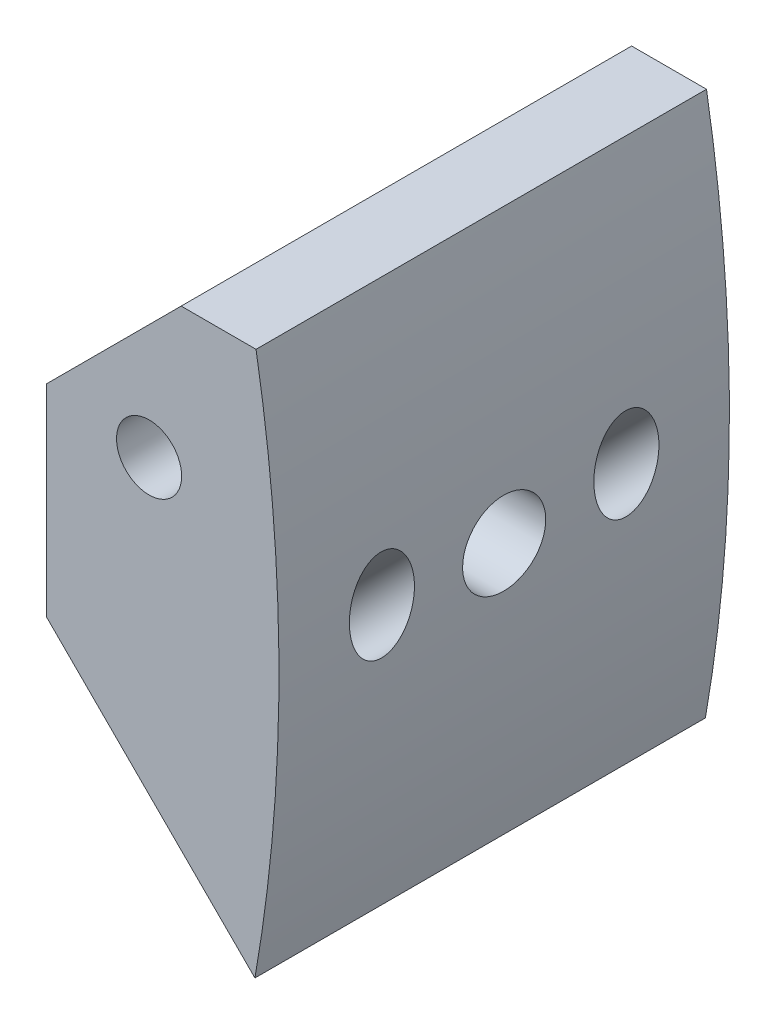
ISO-10303-21;
HEADER;
FILE_DESCRIPTION(('STEP AP214'),'2;1');
FILE_NAME('part.step','',(''),(''),'','','');
FILE_SCHEMA(('AUTOMOTIVE_DESIGN { 1 0 10303 214 1 1 1 1 }'));
ENDSEC;
DATA;
#1=APPLICATION_CONTEXT('core data for automotive mechanical design processes');
#2=APPLICATION_PROTOCOL_DEFINITION('international standard','automotive_design',2000,#1);
#3=PRODUCT_CONTEXT('',#1,'mechanical');
#4=PRODUCT('Part','Part','',(#3));
#5=PRODUCT_RELATED_PRODUCT_CATEGORY('part','',(#4));
#6=PRODUCT_DEFINITION_FORMATION('','',#4);
#7=PRODUCT_DEFINITION_CONTEXT('part definition',#1,'design');
#8=PRODUCT_DEFINITION('design','',#6,#7);
#9=PRODUCT_DEFINITION_SHAPE('','',#8);
#10=(LENGTH_UNIT() NAMED_UNIT(*) SI_UNIT(.MILLI.,.METRE.));
#11=(NAMED_UNIT(*) PLANE_ANGLE_UNIT() SI_UNIT($,.RADIAN.));
#12=(NAMED_UNIT(*) SI_UNIT($,.STERADIAN.) SOLID_ANGLE_UNIT());
#13=UNCERTAINTY_MEASURE_WITH_UNIT(LENGTH_MEASURE(1.E-05),#10,'distance_accuracy_value','');
#14=(GEOMETRIC_REPRESENTATION_CONTEXT(3) GLOBAL_UNCERTAINTY_ASSIGNED_CONTEXT((#13)) GLOBAL_UNIT_ASSIGNED_CONTEXT((#10,
#11,#12)) REPRESENTATION_CONTEXT('',''));
#15=CARTESIAN_POINT('',(0.,0.,0.));
#16=DIRECTION('',(0.,0.,1.));
#17=DIRECTION('',(1.,0.,0.));
#18=AXIS2_PLACEMENT_3D('',#15,#16,#17);
#19=CARTESIAN_POINT('',(-47.244,-6.58729003997056,18.7198));
#20=DIRECTION('',(0.,0.,-1.));
#21=DIRECTION('',(-1.,0.,0.));
#22=AXIS2_PLACEMENT_3D('',#19,#20,#21);
#23=CYLINDRICAL_SURFACE('',#22,66.294);
#24=CARTESIAN_POINT('',(19.05,-6.58729003997057,11.0871));
#25=CARTESIAN_POINT('',(19.0499996965808,-6.49029011763072,11.0870957038607));
#26=CARTESIAN_POINT('',(19.0497848234207,-6.3932202802505,11.0789012698086));
#27=CARTESIAN_POINT('',(19.0489483082885,-6.20175517058592,11.0463264377884));
#28=CARTESIAN_POINT('',(19.0483261795265,-6.10736324023725,11.0219266691839));
#29=CARTESIAN_POINT('',(19.0467456131249,-5.9240554226076,10.9576373316004));
#30=CARTESIAN_POINT('',(19.0457873390727,-5.83513689635548,10.9177552961659));
#31=CARTESIAN_POINT('',(19.0436425963866,-5.66528198959924,10.8236442233512));
#32=CARTESIAN_POINT('',(19.0424561837321,-5.58434365830945,10.7694187042804));
#33=CARTESIAN_POINT('',(19.0399882662549,-5.43269097827881,10.648135365401));
#34=CARTESIAN_POINT('',(19.0387067314511,-5.36197987388215,10.5810734891702));
#35=CARTESIAN_POINT('',(19.0361932730682,-5.2328160281673,10.4360277439134));
#36=CARTESIAN_POINT('',(19.0349613514597,-5.17436377337172,10.3580434416087));
#37=CARTESIAN_POINT('',(19.032685916437,-5.07137329412594,10.193356396944));
#38=CARTESIAN_POINT('',(19.0316424263435,-5.02683679141392,10.1066525775073));
#39=CARTESIAN_POINT('',(19.0298617644816,-4.95295334594229,9.92699542845012));
#40=CARTESIAN_POINT('',(19.0291245916354,-4.92360634973139,9.8340421208227));
#41=CARTESIAN_POINT('',(19.0280398829489,-4.8809413263353,9.64454701808837));
#42=CARTESIAN_POINT('',(19.0276922582412,-4.86761964325202,9.54800604662771));
#43=CARTESIAN_POINT('',(19.0274255738305,-4.85737214696877,9.35405747529695));
#44=CARTESIAN_POINT('',(19.0275065126475,-4.86044627714623,9.25664987842089));
#45=CARTESIAN_POINT('',(19.0280877451644,-4.88290002733904,9.06375790994818));
#46=CARTESIAN_POINT('',(19.0285879370586,-4.9022756889159,8.96827307721711));
#47=CARTESIAN_POINT('',(19.0299511275993,-4.95677637963944,8.78191186219641));
#48=CARTESIAN_POINT('',(19.0308141269425,-4.99190143902833,8.69103548875638));
#49=CARTESIAN_POINT('',(19.0328057619046,-5.07690839178007,8.51645815347474));
#50=CARTESIAN_POINT('',(19.0339344301956,-5.12679210035419,8.43275807590188));
#51=CARTESIAN_POINT('',(19.036330130382,-5.23989896873011,8.27491899974449));
#52=CARTESIAN_POINT('',(19.0375971625022,-5.30312215019547,8.20078001668767));
#53=CARTESIAN_POINT('',(19.0401272077553,-5.44113569133263,8.06414459374687));
#54=CARTESIAN_POINT('',(19.0413902195809,-5.51592948571427,8.00165162313855));
#55=CARTESIAN_POINT('',(19.0437694771187,-5.67494899416805,7.89010889306282));
#56=CARTESIAN_POINT('',(19.0448857228083,-5.75917470968648,7.84105913565682));
#57=CARTESIAN_POINT('',(19.0468456242787,-5.93466908917434,7.75779558672417));
#58=CARTESIAN_POINT('',(19.0476892780887,-6.02593780405674,7.7235819024575));
#59=CARTESIAN_POINT('',(19.0490088586277,-6.21292650873927,7.67096391731566));
#60=CARTESIAN_POINT('',(19.0494847861157,-6.30864648935182,7.65255958381096));
#61=CARTESIAN_POINT('',(19.0500151667441,-6.50179041461503,7.6320869831968));
#62=CARTESIAN_POINT('',(19.050069743725,-6.59921385015981,7.63001391611013));
#63=CARTESIAN_POINT('',(19.0497515988955,-6.79302563666371,7.64225018957412));
#64=CARTESIAN_POINT('',(19.0493788774536,-6.88941398851568,7.65655951599222));
#65=CARTESIAN_POINT('',(19.0482482255402,-7.07840609586226,7.701150411519));
#66=CARTESIAN_POINT('',(19.0474903475853,-7.17101036546318,7.73142980310495));
#67=CARTESIAN_POINT('',(19.0456747947692,-7.34982136180033,7.8070990889758));
#68=CARTESIAN_POINT('',(19.0446171194631,-7.43602807904024,7.85248900568973));
#69=CARTESIAN_POINT('',(19.0423208355982,-7.59961895748349,7.95710324508831));
#70=CARTESIAN_POINT('',(19.0410821847991,-7.67700105145836,8.0163307994683));
#71=CARTESIAN_POINT('',(19.0385636995081,-7.82072532163809,8.14693430724377));
#72=CARTESIAN_POINT('',(19.0372838649327,-7.88706747548156,8.21831028524527));
#73=CARTESIAN_POINT('',(19.0348269424432,-8.00684464408938,8.37120508147937));
#74=CARTESIAN_POINT('',(19.0336498792266,-8.06027656174518,8.45272632642443));
#75=CARTESIAN_POINT('',(19.0315315961777,-8.15269532300266,8.623585127682));
#76=CARTESIAN_POINT('',(19.0305903758834,-8.19168219490804,8.71292266867879));
#77=CARTESIAN_POINT('',(19.0290500742096,-8.25409875185362,8.89686640836887));
#78=CARTESIAN_POINT('',(19.0284509486511,-8.27753044579814,8.99147192500783));
#79=CARTESIAN_POINT('',(19.0276622613252,-8.30817809781455,9.18327581664484));
#80=CARTESIAN_POINT('',(19.0274726994678,-8.31539405945109,9.2804741910729));
#81=CARTESIAN_POINT('',(19.0275245282422,-8.31340516458679,9.47467358644387));
#82=CARTESIAN_POINT('',(19.0277657905008,-8.30420519955953,9.57167465755556));
#83=CARTESIAN_POINT('',(19.0286517995259,-8.26965564739085,9.76275500902498));
#84=CARTESIAN_POINT('',(19.0292965470955,-8.24430602810661,9.85683428356705));
#85=CARTESIAN_POINT('',(19.0309168270153,-8.17817727251902,10.0394027224271));
#86=CARTESIAN_POINT('',(19.0318923651202,-8.13739786778749,10.1278917894623));
#87=CARTESIAN_POINT('',(19.0340642058242,-8.0415692386408,10.2967653761377));
#88=CARTESIAN_POINT('',(19.0352605002712,-7.98652054112911,10.3771501948806));
#89=CARTESIAN_POINT('',(19.0377393259736,-7.86370321135577,10.5275549056016));
#90=CARTESIAN_POINT('',(19.0390218737009,-7.79593214503367,10.5975728095751));
#91=CARTESIAN_POINT('',(19.0415287850443,-7.64957731166828,10.7252560272962));
#92=CARTESIAN_POINT('',(19.0427531341612,-7.57099086895314,10.7829182752599));
#93=CARTESIAN_POINT('',(19.0450059931981,-7.4052095376815,10.8842608260837));
#94=CARTESIAN_POINT('',(19.046034383979,-7.31800946079425,10.9279326339297));
#95=CARTESIAN_POINT('',(19.0477771868896,-7.13757985767573,10.9999656701603));
#96=CARTESIAN_POINT('',(19.0484919737294,-7.04435768066933,11.0283451798781));
#97=CARTESIAN_POINT('',(19.0493357183067,-6.89000278840161,11.0614566402422));
#98=CARTESIAN_POINT('',(19.0495837449924,-6.82987223063493,11.0710608245613));
#99=CARTESIAN_POINT('',(19.0499159809689,-6.70893362867922,11.0838838509421));
#100=CARTESIAN_POINT('',(19.0500001902958,-6.64812558463983,11.0871026944142));
#101=CARTESIAN_POINT('',(19.05,-6.58729003997057,11.0871));
#102=B_SPLINE_CURVE_WITH_KNOTS('',3,(#24,#25,#26,#27,#28,#29,#30,#31,#32,#33,#34,#35,#36,#37,
#38,#39,#40,#41,#42,#43,#44,#45,#46,#47,#48,#49,#50,#51,#52,#53,#54,#55,#56,#57,#58,#59,#60,#61,
#62,#63,#64,#65,#66,#67,#68,#69,#70,#71,#72,#73,#74,#75,#76,#77,#78,#79,#80,#81,#82,#83,#84,#85,
#86,#87,#88,#89,#90,#91,#92,#93,#94,#95,#96,#97,#98,#99,#100,#101),.UNSPECIFIED.,.T.,.F.,(4,2,2,
2,2,2,2,2,2,2,2,2,2,2,2,2,2,2,2,2,2,2,2,2,2,2,2,2,2,2,2,2,2,2,2,2,2,2,4),(0.,0.290777711365592,
0.581903623562939,0.872888053476482,1.16380117397663,1.4548063782738,1.74582312964384,
2.03687587306248,2.3279275922707,2.61891290046217,2.90989720374316,3.20081086880587,
3.49172509248768,3.78267511148184,4.07362560298806,4.36466262879617,4.65569969923233,
4.94673887373656,5.23777744755217,5.52873047805297,5.81968325755811,6.11059637582465,
6.40150992590461,6.69249148509315,6.98347363365747,7.27452551839871,7.56557683284851,
7.85659055158264,8.14760420634426,8.43853116189429,8.72945869648085,9.02039129249465,
9.31131314715163,9.60229071819405,9.89334040552073,10.1845664851068,10.4754436387533,
10.6578110461634,10.84017841329),.UNSPECIFIED.);
#103=CARTESIAN_POINT('',(19.05,-6.58729003997057,11.0871));
#104=VERTEX_POINT('',#103);
#105=EDGE_CURVE('E98',#104,#104,#102,.T.);
#106=ORIENTED_EDGE('',*,*,#105,.T.);
#107=EDGE_LOOP('',(#106));
#108=FACE_BOUND('',#107,.T.);
#109=CARTESIAN_POINT('',(19.03093950099,-8.17689066280571,14.4399));
#110=CARTESIAN_POINT('',(19.0309397504888,-8.17688373606508,14.4994299092389));
#111=CARTESIAN_POINT('',(19.0310783077648,-8.17113538618392,14.5590630278307));
#112=CARTESIAN_POINT('',(19.0316118028481,-8.14864667310725,14.6762839148779));
#113=CARTESIAN_POINT('',(19.0320074198384,-8.13187718939261,14.7338658374767));
#114=CARTESIAN_POINT('',(19.0329949072261,-8.08890022916926,14.8448157281223));
#115=CARTESIAN_POINT('',(19.0335852014114,-8.06276841304478,14.8982134109924));
#116=CARTESIAN_POINT('',(19.0348944566818,-8.0027362014352,15.0003633799949));
#117=CARTESIAN_POINT('',(19.0356134275248,-7.96883521673711,15.0491153133967));
#118=CARTESIAN_POINT('',(19.0374439992075,-7.87857983434721,15.1619693773191));
#119=CARTESIAN_POINT('',(19.0385893749711,-7.8189027046317,15.2234114026122));
#120=CARTESIAN_POINT('',(19.0408509914559,-7.69052187414516,15.3360267127651));
#121=CARTESIAN_POINT('',(19.041967154257,-7.62179650096414,15.387174572624));
#122=CARTESIAN_POINT('',(19.0444749663972,-7.44905546769553,15.4983692864074));
#123=CARTESIAN_POINT('',(19.0457959560247,-7.34199252826299,15.5536745420608));
#124=CARTESIAN_POINT('',(19.0479480347883,-7.12057220248545,15.646582539313));
#125=CARTESIAN_POINT('',(19.0487787239021,-7.00620894407258,15.6841708211072));
#126=CARTESIAN_POINT('',(19.0498564383536,-6.76997817793614,15.7436243327146));
#127=CARTESIAN_POINT('',(19.0500858867901,-6.64798929327223,15.7650033410691));
#128=CARTESIAN_POINT('',(19.0498557455246,-6.40218118767083,15.7907531443561));
#129=CARTESIAN_POINT('',(19.049395635741,-6.27836065501827,15.7951110926511));
#130=CARTESIAN_POINT('',(19.047618940738,-6.00612452257654,15.7858256043066));
#131=CARTESIAN_POINT('',(19.0461473478288,-5.85782262926841,15.7683452337203));
#132=CARTESIAN_POINT('',(19.0423022857426,-5.56668691032533,15.7071205546782));
#133=CARTESIAN_POINT('',(19.0399301478624,-5.42384535400005,15.6634149604779));
#134=CARTESIAN_POINT('',(19.0355406405651,-5.19998639905921,15.5683606782304));
#135=CARTESIAN_POINT('',(19.0337064139218,-5.11532901326914,15.5255267391557));
#136=CARTESIAN_POINT('',(19.0299155060611,-4.95356747771057,15.4273827974884));
#137=CARTESIAN_POINT('',(19.027959034268,-4.87645096090689,15.3720937306922));
#138=CARTESIAN_POINT('',(19.024542635703,-4.74941051854124,15.2623773367114));
#139=CARTESIAN_POINT('',(19.0230696560592,-4.69726495319207,15.2105314965473));
#140=CARTESIAN_POINT('',(19.0202826253287,-4.60195624247808,15.0991094905497));
#141=CARTESIAN_POINT('',(19.0189683855247,-4.55878238621959,15.039542682043));
#142=CARTESIAN_POINT('',(19.0168442878389,-4.49064821714003,14.9246017053715));
#143=CARTESIAN_POINT('',(19.0159863530743,-4.46381854329087,14.8703411050301));
#144=CARTESIAN_POINT('',(19.0145527172215,-4.41954414804442,14.758094370884));
#145=CARTESIAN_POINT('',(19.013976842422,-4.40209364968191,14.7001105550368));
#146=CARTESIAN_POINT('',(19.0131684031765,-4.37771401365817,14.5816521154748));
#147=CARTESIAN_POINT('',(19.0129374776605,-4.37083509949825,14.5211669953215));
#148=CARTESIAN_POINT('',(19.0128527528125,-4.36830329984476,14.3999620861377));
#149=CARTESIAN_POINT('',(19.0129988993884,-4.37264880418048,14.3392423320138));
#150=CARTESIAN_POINT('',(19.0136241974261,-4.39144250263048,14.2242810975946));
#151=CARTESIAN_POINT('',(19.014076552431,-4.40507828136987,14.1699031685768));
#152=CARTESIAN_POINT('',(19.015241347591,-4.44073747283191,14.0639978827775));
#153=CARTESIAN_POINT('',(19.0159538266458,-4.46276214007438,14.0124709536704));
#154=CARTESIAN_POINT('',(19.0176312994868,-4.51572192999796,13.9099739407884));
#155=CARTESIAN_POINT('',(19.0186096764612,-4.54714242000995,13.8592568449645));
#156=CARTESIAN_POINT('',(19.0207157564483,-4.61673228492073,13.7627203721038));
#157=CARTESIAN_POINT('',(19.0218435475059,-4.65490564355157,13.7169039118506));
#158=CARTESIAN_POINT('',(19.0247893239268,-4.75812271316617,13.6077150544386));
#159=CARTESIAN_POINT('',(19.0266591863696,-4.82676178455779,13.5477309020521));
#160=CARTESIAN_POINT('',(19.0303784714529,-4.97280178226283,13.4395477614496));
#161=CARTESIAN_POINT('',(19.0322278326506,-5.05022380333932,13.3913780646114));
#162=CARTESIAN_POINT('',(19.0363846714238,-5.23939545277268,13.2912285417164));
#163=CARTESIAN_POINT('',(19.0386232667553,-5.35361163971813,13.2439114715794));
#164=CARTESIAN_POINT('',(19.0425725957761,-5.58802140924562,13.1682090928461));
#165=CARTESIAN_POINT('',(19.0442830280784,-5.70821835939102,13.1398345827938));
#166=CARTESIAN_POINT('',(19.0470935469368,-5.95419167506841,13.1002904478532));
#167=CARTESIAN_POINT('',(19.0481788191046,-6.08003276940403,13.089528095931));
#168=CARTESIAN_POINT('',(19.04962884144,-6.33208350038816,13.0857656228831));
#169=CARTESIAN_POINT('',(19.0499928008706,-6.45829338976348,13.0927849757213));
#170=CARTESIAN_POINT('',(19.0500082655554,-6.73136712643059,13.1274798056241));
#171=CARTESIAN_POINT('',(19.0495176363884,-6.87779706126136,13.1586910103579));
#172=CARTESIAN_POINT('',(19.0476554871312,-7.16258461609256,13.2472024912822));
#173=CARTESIAN_POINT('',(19.0462858506555,-7.30095880872602,13.3044469049614));
#174=CARTESIAN_POINT('',(19.0436559695904,-7.50760963247391,13.4177007951448));
#175=CARTESIAN_POINT('',(19.0425877251546,-7.58107921862573,13.4642957488383));
#176=CARTESIAN_POINT('',(19.0403536495612,-7.72029355684978,13.5678924769256));
#177=CARTESIAN_POINT('',(19.0391879872331,-7.78605121734095,13.6248764412789));
#178=CARTESIAN_POINT('',(19.0371545918018,-7.89312224415153,13.7357716497249));
#179=CARTESIAN_POINT('',(19.0362781184018,-7.93662249090891,13.7875615527944));
#180=CARTESIAN_POINT('',(19.0346408386178,-8.01478112524079,13.8975035982089));
#181=CARTESIAN_POINT('',(19.0338799314092,-8.04944723818555,13.9556501177115));
#182=CARTESIAN_POINT('',(19.0326901777474,-8.10233142246484,14.0665400018734));
#183=CARTESIAN_POINT('',(19.0322263601696,-8.1223770676385,14.1184095431279));
#184=CARTESIAN_POINT('',(19.031497923776,-8.15351458340183,14.2247124202177));
#185=CARTESIAN_POINT('',(19.0312327782093,-8.16463013657257,14.2791385669838));
#186=CARTESIAN_POINT('',(19.0310355972113,-8.17287968059016,14.3516161549604));
#187=CARTESIAN_POINT('',(19.0309996503764,-8.17438129465964,14.3692355013328));
#188=CARTESIAN_POINT('',(19.0309515629479,-8.17638790908686,14.4045335208673));
#189=CARTESIAN_POINT('',(19.0309394268578,-8.17689272091015,14.4222122046192));
#190=CARTESIAN_POINT('',(19.03093950099,-8.17689066280571,14.4399));
#191=B_SPLINE_CURVE_WITH_KNOTS('',3,(#109,#110,#111,#112,#113,#114,#115,#116,#117,#118,#119,
#120,#121,#122,#123,#124,#125,#126,#127,#128,#129,#130,#131,#132,#133,#134,#135,#136,#137,#138,
#139,#140,#141,#142,#143,#144,#145,#146,#147,#148,#149,#150,#151,#152,#153,#154,#155,#156,#157,
#158,#159,#160,#161,#162,#163,#164,#165,#166,#167,#168,#169,#170,#171,#172,#173,#174,#175,#176,
#177,#178,#179,#180,#181,#182,#183,#184,#185,#186,#187,#188,#189,#190),.UNSPECIFIED.,.T.,.F.,(4,
2,2,2,2,2,2,2,2,2,2,2,2,2,2,2,2,2,2,2,2,2,2,2,2,2,2,2,2,2,2,2,2,2,2,2,2,2,2,2,4),(0.,
0.178506171985479,0.357485907280734,0.535050712911975,0.712628989500063,0.968185601983157,
1.22436585657518,1.58395316400954,1.94383344457157,2.31412293514639,2.68469184760296,
3.13054371649606,3.5757390226817,3.85954039913289,4.14286824760459,4.36272671799192,
4.58232118248879,4.7631842541117,4.94393579775003,5.12554343021684,5.30712501206479,
5.47457746690626,5.64205497333309,5.82039753309282,5.99884565580937,6.27084425573026,
6.54351055082744,6.91247637575028,7.28165235701928,7.65925056727915,8.03726248996457,
8.48425685284617,8.93029654053938,9.19057455638824,9.45041049905095,9.65262032290747,
9.8546527045458,10.020812348109,10.1865298684965,10.2395583993646,10.2925969590509),.UNSPECIFIED.);
#192=CARTESIAN_POINT('',(19.03093950099,-8.17689066280571,14.4399));
#193=VERTEX_POINT('',#192);
#194=EDGE_CURVE('E148',#193,#193,#191,.T.);
#195=ORIENTED_EDGE('',*,*,#194,.T.);
#196=EDGE_LOOP('',(#195));
#197=FACE_BOUND('',#196,.T.);
#198=CARTESIAN_POINT('',(19.03093950099,-8.17689066280571,4.2799));
#199=CARTESIAN_POINT('',(19.0309397504888,-8.17688373606507,4.33942990923894));
#200=CARTESIAN_POINT('',(19.0310783077648,-8.17113538618392,4.39906302783068));
#201=CARTESIAN_POINT('',(19.0316118028481,-8.14864667310726,4.5162839148779));
#202=CARTESIAN_POINT('',(19.0320074198384,-8.13187718939262,4.57386583747667));
#203=CARTESIAN_POINT('',(19.0329949072261,-8.08890022916927,4.68481572812225));
#204=CARTESIAN_POINT('',(19.0335852014114,-8.06276841304478,4.73821341099243));
#205=CARTESIAN_POINT('',(19.0348944566818,-8.00273620143521,4.84036337999486));
#206=CARTESIAN_POINT('',(19.0356134275248,-7.96883521673713,4.88911531339669));
#207=CARTESIAN_POINT('',(19.0374439992075,-7.87857983434722,5.00196937731906));
#208=CARTESIAN_POINT('',(19.0385893749711,-7.8189027046317,5.06341140261225));
#209=CARTESIAN_POINT('',(19.0408509914559,-7.69052187414516,5.17602671276506));
#210=CARTESIAN_POINT('',(19.0419671542571,-7.62179650096414,5.227174572624));
#211=CARTESIAN_POINT('',(19.0444749663972,-7.44905546769553,5.3383692864074));
#212=CARTESIAN_POINT('',(19.0457959560247,-7.34199252826299,5.39367454206078));
#213=CARTESIAN_POINT('',(19.0479480347883,-7.12057220248546,5.48658253931305));
#214=CARTESIAN_POINT('',(19.0487787239021,-7.00620894407259,5.52417082110724));
#215=CARTESIAN_POINT('',(19.0498564383536,-6.76997817793616,5.58362433271456));
#216=CARTESIAN_POINT('',(19.0500858867901,-6.64798929327225,5.60500334106913));
#217=CARTESIAN_POINT('',(19.0498557455246,-6.40218118767085,5.63075314435609));
#218=CARTESIAN_POINT('',(19.049395635741,-6.27836065501829,5.63511109265105));
#219=CARTESIAN_POINT('',(19.047618940738,-6.00612452257656,5.62582560430656));
#220=CARTESIAN_POINT('',(19.0461473478288,-5.85782262926843,5.60834523372034));
#221=CARTESIAN_POINT('',(19.0423022857426,-5.56668691032535,5.54712055467825));
#222=CARTESIAN_POINT('',(19.0399301478624,-5.42384535400007,5.50341496047786));
#223=CARTESIAN_POINT('',(19.0355406405651,-5.19998639905923,5.4083606782304));
#224=CARTESIAN_POINT('',(19.0337064139218,-5.11532901326916,5.36552673915569));
#225=CARTESIAN_POINT('',(19.0299155060611,-4.95356747771059,5.26738279748837));
#226=CARTESIAN_POINT('',(19.027959034268,-4.87645096090691,5.21209373069217));
#227=CARTESIAN_POINT('',(19.024542635703,-4.74941051854125,5.10237733671143));
#228=CARTESIAN_POINT('',(19.0230696560592,-4.69726495319208,5.05053149654736));
#229=CARTESIAN_POINT('',(19.0202826253288,-4.60195624247809,4.93910949054972));
#230=CARTESIAN_POINT('',(19.0189683855247,-4.55878238621961,4.87954268204305));
#231=CARTESIAN_POINT('',(19.0168442878389,-4.49064821714005,4.76460170537153));
#232=CARTESIAN_POINT('',(19.0159863530743,-4.46381854329089,4.71034110503015));
#233=CARTESIAN_POINT('',(19.0145527172215,-4.41954414804444,4.59809437088406));
#234=CARTESIAN_POINT('',(19.013976842422,-4.40209364968192,4.54011055503678));
#235=CARTESIAN_POINT('',(19.0131684031765,-4.37771401365816,4.42165211547479));
#236=CARTESIAN_POINT('',(19.0129374776606,-4.37083509949824,4.3611669953215));
#237=CARTESIAN_POINT('',(19.0128527528125,-4.36830329984476,4.23996208613773));
#238=CARTESIAN_POINT('',(19.0129988993884,-4.37264880418049,4.1792423320138));
#239=CARTESIAN_POINT('',(19.0136241974261,-4.3914425026305,4.06428109759459));
#240=CARTESIAN_POINT('',(19.014076552431,-4.40507828136988,4.00990316857684));
#241=CARTESIAN_POINT('',(19.015241347591,-4.44073747283192,3.90399788277749));
#242=CARTESIAN_POINT('',(19.0159538266458,-4.46276214007439,3.85247095367045));
#243=CARTESIAN_POINT('',(19.0176312994868,-4.51572192999796,3.74997394078838));
#244=CARTESIAN_POINT('',(19.0186096764612,-4.54714242000995,3.69925684496453));
#245=CARTESIAN_POINT('',(19.0207157564483,-4.61673228492073,3.60272037210379));
#246=CARTESIAN_POINT('',(19.0218435475059,-4.65490564355157,3.55690391185064));
#247=CARTESIAN_POINT('',(19.0247893239268,-4.75812271316617,3.44771505443858));
#248=CARTESIAN_POINT('',(19.0266591863696,-4.82676178455779,3.38773090205209));
#249=CARTESIAN_POINT('',(19.0303784714529,-4.97280178226283,3.2795477614496));
#250=CARTESIAN_POINT('',(19.0322278326506,-5.05022380333931,3.23137806461139));
#251=CARTESIAN_POINT('',(19.0363846714238,-5.23939545277267,3.13122854171637));
#252=CARTESIAN_POINT('',(19.0386232667553,-5.35361163971813,3.08391147157942));
#253=CARTESIAN_POINT('',(19.0425725957761,-5.58802140924561,3.00820909284607));
#254=CARTESIAN_POINT('',(19.0442830280784,-5.70821835939102,2.97983458279381));
#255=CARTESIAN_POINT('',(19.0470935469368,-5.9541916750684,2.94029044785316));
#256=CARTESIAN_POINT('',(19.0481788191046,-6.08003276940402,2.92952809593101));
#257=CARTESIAN_POINT('',(19.04962884144,-6.33208350038815,2.92576562288308));
#258=CARTESIAN_POINT('',(19.0499928008706,-6.45829338976347,2.9327849757213));
#259=CARTESIAN_POINT('',(19.0500082655554,-6.73136712643058,2.96747980562409));
#260=CARTESIAN_POINT('',(19.0495176363884,-6.87779706126134,2.9986910103579));
#261=CARTESIAN_POINT('',(19.0476554871312,-7.16258461609254,3.08720249128223));
#262=CARTESIAN_POINT('',(19.0462858506555,-7.30095880872601,3.14444690496137));
#263=CARTESIAN_POINT('',(19.0436559695904,-7.5076096324739,3.25770079514476));
#264=CARTESIAN_POINT('',(19.0425877251546,-7.58107921862571,3.3042957488383));
#265=CARTESIAN_POINT('',(19.0403536495612,-7.72029355684977,3.40789247692561));
#266=CARTESIAN_POINT('',(19.0391879872331,-7.78605121734095,3.46487644127884));
#267=CARTESIAN_POINT('',(19.0371545918018,-7.89312224415153,3.57577164972491));
#268=CARTESIAN_POINT('',(19.0362781184018,-7.93662249090891,3.62756155279442));
#269=CARTESIAN_POINT('',(19.0346408386178,-8.01478112524079,3.73750359820891));
#270=CARTESIAN_POINT('',(19.0338799314092,-8.04944723818555,3.79565011771152));
#271=CARTESIAN_POINT('',(19.0326901777474,-8.10233142246485,3.9065400018734));
#272=CARTESIAN_POINT('',(19.0322263601695,-8.12237706763851,3.95840954312786));
#273=CARTESIAN_POINT('',(19.031497923776,-8.15351458340183,4.06471242021765));
#274=CARTESIAN_POINT('',(19.0312327782093,-8.16463013657258,4.11913856698381));
#275=CARTESIAN_POINT('',(19.0310355972113,-8.17287968059017,4.19161615496044));
#276=CARTESIAN_POINT('',(19.0309996503764,-8.17438129465965,4.20923550133281));
#277=CARTESIAN_POINT('',(19.0309515629479,-8.17638790908687,4.24453352086731));
#278=CARTESIAN_POINT('',(19.0309394268578,-8.17689272091015,4.26221220461919));
#279=CARTESIAN_POINT('',(19.03093950099,-8.17689066280571,4.2799));
#280=B_SPLINE_CURVE_WITH_KNOTS('',3,(#198,#199,#200,#201,#202,#203,#204,#205,#206,#207,#208,
#209,#210,#211,#212,#213,#214,#215,#216,#217,#218,#219,#220,#221,#222,#223,#224,#225,#226,#227,
#228,#229,#230,#231,#232,#233,#234,#235,#236,#237,#238,#239,#240,#241,#242,#243,#244,#245,#246,
#247,#248,#249,#250,#251,#252,#253,#254,#255,#256,#257,#258,#259,#260,#261,#262,#263,#264,#265,
#266,#267,#268,#269,#270,#271,#272,#273,#274,#275,#276,#277,#278,#279),.UNSPECIFIED.,.T.,.F.,(4,
2,2,2,2,2,2,2,2,2,2,2,2,2,2,2,2,2,2,2,2,2,2,2,2,2,2,2,2,2,2,2,2,2,2,2,2,2,2,2,4),(0.,
0.17850617198548,0.357485907280734,0.535050712911973,0.712628989500063,0.968185601983158,
1.22436585657519,1.58395316400954,1.94383344457157,2.31412293514638,2.68469184760295,
3.13054371649605,3.57573902268169,3.85954039913288,4.14286824760457,4.3627267179919,
4.58232118248878,4.76318425411169,4.94393579775002,5.12554343021683,5.3071250120648,
5.47457746690627,5.64205497333309,5.82039753309282,5.99884565580938,6.27084425573026,
6.54351055082744,6.91247637575027,7.28165235701927,7.65925056727914,8.03726248996456,
8.48425685284616,8.93029654053936,9.19057455638822,9.45041049905094,9.65262032290746,
9.8546527045458,10.020812348109,10.1865298684965,10.2395583993646,10.2925969590509),.UNSPECIFIED.);
#281=CARTESIAN_POINT('',(19.03093950099,-8.17689066280571,4.2799));
#282=VERTEX_POINT('',#281);
#283=EDGE_CURVE('E110',#282,#282,#280,.T.);
#284=ORIENTED_EDGE('',*,*,#283,.T.);
#285=EDGE_LOOP('',(#284));
#286=FACE_BOUND('',#285,.T.);
#287=CARTESIAN_POINT('',(-47.244,-6.58729003997056,18.7198));
#288=DIRECTION('',(0.,0.,1.));
#289=DIRECTION('',(-1.,0.,0.));
#290=AXIS2_PLACEMENT_3D('',#287,#288,#289);
#291=CIRCLE('',#290,66.294);
#292=CARTESIAN_POINT('',(18.0525250935151,-18.0440891877234,18.7198));
#293=VERTEX_POINT('',#292);
#294=CARTESIAN_POINT('',(18.0983115580606,4.60541992005886,18.7198));
#295=VERTEX_POINT('',#294);
#296=EDGE_CURVE('E136',#293,#295,#291,.T.);
#297=ORIENTED_EDGE('',*,*,#296,.F.);
#298=DIRECTION('',(0.,0.,-1.));
#299=VECTOR('',#298,1.);
#300=CARTESIAN_POINT('',(18.0525250935151,-18.0440891877234,18.7198));
#301=LINE('',#300,#299);
#302=CARTESIAN_POINT('',(18.0525250935151,-18.0440891877234,0.));
#303=VERTEX_POINT('',#302);
#304=EDGE_CURVE('E109',#293,#303,#301,.T.);
#305=ORIENTED_EDGE('',*,*,#304,.T.);
#306=CARTESIAN_POINT('',(-47.244,-6.58729003997056,0.));
#307=DIRECTION('',(0.,0.,1.));
#308=DIRECTION('',(-1.,0.,0.));
#309=AXIS2_PLACEMENT_3D('',#306,#307,#308);
#310=CIRCLE('',#309,66.294);
#311=CARTESIAN_POINT('',(18.0983115580606,4.60541992005886,0.));
#312=VERTEX_POINT('',#311);
#313=EDGE_CURVE('E135',#303,#312,#310,.T.);
#314=ORIENTED_EDGE('',*,*,#313,.T.);
#315=DIRECTION('',(0.,0.,-1.));
#316=VECTOR('',#315,1.);
#317=CARTESIAN_POINT('',(18.0983115580606,4.60541992005886,18.7198));
#318=LINE('',#317,#316);
#319=EDGE_CURVE('E131',#312,#295,#318,.F.);
#320=ORIENTED_EDGE('',*,*,#319,.T.);
#321=EDGE_LOOP('',(#297,#305,#314,#320));
#322=FACE_BOUND('',#321,.T.);
#323=ADVANCED_FACE('F42',(#108,#197,#286,#322),#23,.T.);
#324=CARTESIAN_POINT('',(-47.244,-6.58729003997056,18.7198));
#325=DIRECTION('',(0.,0.,-1.));
#326=DIRECTION('',(-1.,0.,0.));
#327=AXIS2_PLACEMENT_3D('',#324,#325,#326);
#328=PLANE('',#327);
#329=CARTESIAN_POINT('',(13.6525,-1.50729003997055,18.7198));
#330=DIRECTION('',(0.,0.,1.));
#331=DIRECTION('',(1.,0.,0.));
#332=AXIS2_PLACEMENT_3D('',#329,#330,#331);
#333=CIRCLE('',#332,1.35254999999999);
#334=CARTESIAN_POINT('',(15.00505,-1.50729003997055,18.7198));
#335=VERTEX_POINT('',#334);
#336=EDGE_CURVE('E113',#335,#335,#333,.T.);
#337=ORIENTED_EDGE('',*,*,#336,.F.);
#338=EDGE_LOOP('',(#337));
#339=FACE_BOUND('',#338,.T.);
#340=DIRECTION('',(1.,0.,0.));
#341=VECTOR('',#340,1.);
#342=CARTESIAN_POINT('',(0.,4.60541992005886,18.7198));
#343=LINE('',#342,#341);
#344=CARTESIAN_POINT('',(14.986,4.60541992005886,18.7198));
#345=VERTEX_POINT('',#344);
#346=EDGE_CURVE('E128',#345,#295,#343,.T.);
#347=ORIENTED_EDGE('',*,*,#346,.F.);
#348=DIRECTION('',(0.707106781186546,0.707106781186549,0.));
#349=VECTOR('',#348,1.);
#350=CARTESIAN_POINT('',(14.986,4.60541992005886,18.7198));
#351=LINE('',#350,#349);
#352=CARTESIAN_POINT('',(9.398,-0.982580079941157,18.7198));
#353=VERTEX_POINT('',#352);
#354=EDGE_CURVE('E67',#345,#353,#351,.F.);
#355=ORIENTED_EDGE('',*,*,#354,.T.);
#356=DIRECTION('',(0.,1.,0.));
#357=VECTOR('',#356,1.);
#358=CARTESIAN_POINT('',(9.398,4.60541992005886,18.7198));
#359=LINE('',#358,#357);
#360=CARTESIAN_POINT('',(9.398,-9.38956409420834,18.7198));
#361=VERTEX_POINT('',#360);
#362=EDGE_CURVE('E92',#361,#353,#359,.T.);
#363=ORIENTED_EDGE('',*,*,#362,.F.);
#364=DIRECTION('',(-0.707106781186548,0.707106781186547,0.));
#365=VECTOR('',#364,1.);
#366=CARTESIAN_POINT('',(7.27621774823213,-7.26778184244048,18.7198));
#367=LINE('',#366,#365);
#368=EDGE_CURVE('E104',#293,#361,#367,.T.);
#369=ORIENTED_EDGE('',*,*,#368,.F.);
#370=ORIENTED_EDGE('',*,*,#296,.T.);
#371=EDGE_LOOP('',(#347,#355,#363,#369,#370));
#372=FACE_BOUND('',#371,.T.);
#373=ADVANCED_FACE('F102',(#339,#372),#328,.F.);
#374=CARTESIAN_POINT('',(-47.244,-6.58729003997056,0.));
#375=DIRECTION('',(0.,0.,-1.));
#376=DIRECTION('',(-1.,0.,0.));
#377=AXIS2_PLACEMENT_3D('',#374,#375,#376);
#378=PLANE('',#377);
#379=DIRECTION('',(0.,1.,0.));
#380=VECTOR('',#379,1.);
#381=CARTESIAN_POINT('',(9.398,4.60541992005886,0.));
#382=LINE('',#381,#380);
#383=CARTESIAN_POINT('',(9.39800000000001,-9.38956409420835,0.));
#384=VERTEX_POINT('',#383);
#385=CARTESIAN_POINT('',(9.398,-0.982580079941164,0.));
#386=VERTEX_POINT('',#385);
#387=EDGE_CURVE('E93',#384,#386,#382,.T.);
#388=ORIENTED_EDGE('',*,*,#387,.T.);
#389=DIRECTION('',(-0.707106781186546,-0.707106781186549,0.));
#390=VECTOR('',#389,1.);
#391=CARTESIAN_POINT('',(-21.7253549800146,-32.1059350599559,0.));
#392=LINE('',#391,#390);
#393=CARTESIAN_POINT('',(14.986,4.60541992005887,0.));
#394=VERTEX_POINT('',#393);
#395=EDGE_CURVE('E11',#386,#394,#392,.F.);
#396=ORIENTED_EDGE('',*,*,#395,.T.);
#397=DIRECTION('',(1.,0.,0.));
#398=VECTOR('',#397,1.);
#399=CARTESIAN_POINT('',(0.,4.60541992005886,0.));
#400=LINE('',#399,#398);
#401=EDGE_CURVE('E129',#394,#312,#400,.T.);
#402=ORIENTED_EDGE('',*,*,#401,.T.);
#403=ORIENTED_EDGE('',*,*,#313,.F.);
#404=DIRECTION('',(0.707106781186548,-0.707106781186547,0.));
#405=VECTOR('',#404,1.);
#406=CARTESIAN_POINT('',(-20.3241370271189,20.3325729329105,0.));
#407=LINE('',#406,#405);
#408=EDGE_CURVE('E138',#384,#303,#407,.T.);
#409=ORIENTED_EDGE('',*,*,#408,.F.);
#410=EDGE_LOOP('',(#388,#396,#402,#403,#409));
#411=FACE_BOUND('',#410,.T.);
#412=CARTESIAN_POINT('',(13.6525,-1.50729003997055,0.));
#413=DIRECTION('',(0.,0.,1.));
#414=DIRECTION('',(1.,0.,0.));
#415=AXIS2_PLACEMENT_3D('',#412,#413,#414);
#416=CIRCLE('',#415,1.35255);
#417=CARTESIAN_POINT('',(15.00505,-1.50729003997055,0.));
#418=VERTEX_POINT('',#417);
#419=EDGE_CURVE('E124',#418,#418,#416,.T.);
#420=ORIENTED_EDGE('',*,*,#419,.T.);
#421=EDGE_LOOP('',(#420));
#422=FACE_BOUND('',#421,.T.);
#423=ADVANCED_FACE('F173',(#411,#422),#378,.T.);
#424=CARTESIAN_POINT('',(0.,4.60541992005886,0.));
#425=DIRECTION('',(0.,-1.,0.));
#426=DIRECTION('',(0.,0.,-1.));
#427=AXIS2_PLACEMENT_3D('',#424,#425,#426);
#428=PLANE('',#427);
#429=ORIENTED_EDGE('',*,*,#401,.F.);
#430=DIRECTION('',(0.,0.,1.));
#431=VECTOR('',#430,1.);
#432=CARTESIAN_POINT('',(14.986,4.60541992005886,0.));
#433=LINE('',#432,#431);
#434=EDGE_CURVE('E143',#394,#345,#433,.T.);
#435=ORIENTED_EDGE('',*,*,#434,.T.);
#436=ORIENTED_EDGE('',*,*,#346,.T.);
#437=ORIENTED_EDGE('',*,*,#319,.F.);
#438=EDGE_LOOP('',(#429,#435,#436,#437));
#439=FACE_BOUND('',#438,.T.);
#440=ADVANCED_FACE('F169',(#439),#428,.F.);
#441=CARTESIAN_POINT('',(13.6525,-1.50729003997055,18.7198));
#442=DIRECTION('',(0.,0.,1.));
#443=DIRECTION('',(1.,0.,0.));
#444=AXIS2_PLACEMENT_3D('',#441,#442,#443);
#445=CYLINDRICAL_SURFACE('',#444,1.35254999999999);
#446=ORIENTED_EDGE('',*,*,#419,.F.);
#447=EDGE_LOOP('',(#446));
#448=FACE_BOUND('',#447,.T.);
#449=ORIENTED_EDGE('',*,*,#336,.T.);
#450=EDGE_LOOP('',(#449));
#451=FACE_BOUND('',#450,.T.);
#452=ADVANCED_FACE('F165',(#448,#451),#445,.F.);
#453=CARTESIAN_POINT('',(7.27621774823213,-7.26778184244048,0.));
#454=DIRECTION('',(0.707106781186547,0.707106781186548,0.));
#455=DIRECTION('',(-0.707106781186548,0.707106781186547,0.));
#456=AXIS2_PLACEMENT_3D('',#453,#454,#455);
#457=PLANE('',#456);
#458=CARTESIAN_POINT('',(12.6517357578998,-12.6432998521082,14.4399));
#459=DIRECTION('',(-0.707106781186547,-0.707106781186548,0.));
#460=DIRECTION('',(0.707106781186548,-0.707106781186547,0.));
#461=AXIS2_PLACEMENT_3D('',#458,#459,#460);
#462=CIRCLE('',#461,1.35254999999999);
#463=CARTESIAN_POINT('',(13.6081330347937,-13.599697129002,14.4399));
#464=VERTEX_POINT('',#463);
#465=EDGE_CURVE('E211',#464,#464,#462,.T.);
#466=ORIENTED_EDGE('',*,*,#465,.F.);
#467=EDGE_LOOP('',(#466));
#468=FACE_BOUND('',#467,.T.);
#469=CARTESIAN_POINT('',(12.6517357578998,-12.6432998521082,4.2799));
#470=DIRECTION('',(-0.707106781186547,-0.707106781186548,0.));
#471=DIRECTION('',(0.707106781186548,-0.707106781186547,0.));
#472=AXIS2_PLACEMENT_3D('',#469,#470,#471);
#473=CIRCLE('',#472,1.35254999999999);
#474=CARTESIAN_POINT('',(13.6081330347937,-13.599697129002,4.2799));
#475=VERTEX_POINT('',#474);
#476=EDGE_CURVE('E117',#475,#475,#473,.T.);
#477=ORIENTED_EDGE('',*,*,#476,.F.);
#478=EDGE_LOOP('',(#477));
#479=FACE_BOUND('',#478,.T.);
#480=ORIENTED_EDGE('',*,*,#368,.T.);
#481=DIRECTION('',(0.,0.,-1.));
#482=VECTOR('',#481,1.);
#483=CARTESIAN_POINT('',(9.398,-9.38956409420834,0.));
#484=LINE('',#483,#482);
#485=EDGE_CURVE('E90',#361,#384,#484,.T.);
#486=ORIENTED_EDGE('',*,*,#485,.T.);
#487=ORIENTED_EDGE('',*,*,#408,.T.);
#488=ORIENTED_EDGE('',*,*,#304,.F.);
#489=EDGE_LOOP('',(#480,#486,#487,#488));
#490=FACE_BOUND('',#489,.T.);
#491=ADVANCED_FACE('F107',(#468,#479,#490),#457,.F.);
#492=CARTESIAN_POINT('',(12.6517357578998,-12.6432998521082,4.2799));
#493=DIRECTION('',(-0.707106781186547,-0.707106781186548,0.));
#494=DIRECTION('',(0.707106781186548,-0.707106781186547,0.));
#495=AXIS2_PLACEMENT_3D('',#492,#493,#494);
#496=CYLINDRICAL_SURFACE('',#495,1.35254999999999);
#497=ORIENTED_EDGE('',*,*,#476,.T.);
#498=EDGE_LOOP('',(#497));
#499=FACE_BOUND('',#498,.T.);
#500=ORIENTED_EDGE('',*,*,#283,.F.);
#501=EDGE_LOOP('',(#500));
#502=FACE_BOUND('',#501,.T.);
#503=ADVANCED_FACE('F155',(#499,#502),#496,.F.);
#504=CARTESIAN_POINT('',(12.6517357578998,-12.6432998521082,14.4399));
#505=DIRECTION('',(-0.707106781186547,-0.707106781186548,0.));
#506=DIRECTION('',(0.707106781186548,-0.707106781186547,0.));
#507=AXIS2_PLACEMENT_3D('',#504,#505,#506);
#508=CYLINDRICAL_SURFACE('',#507,1.35254999999999);
#509=ORIENTED_EDGE('',*,*,#465,.T.);
#510=EDGE_LOOP('',(#509));
#511=FACE_BOUND('',#510,.T.);
#512=ORIENTED_EDGE('',*,*,#194,.F.);
#513=EDGE_LOOP('',(#512));
#514=FACE_BOUND('',#513,.T.);
#515=ADVANCED_FACE('F159',(#511,#514),#508,.F.);
#516=CARTESIAN_POINT('',(0.,-6.58729003997057,9.3599));
#517=DIRECTION('',(-1.,0.,0.));
#518=DIRECTION('',(0.,0.,1.));
#519=AXIS2_PLACEMENT_3D('',#516,#517,#518);
#520=CYLINDRICAL_SURFACE('',#519,1.72719999999999);
#521=CARTESIAN_POINT('',(9.398,-6.58729003997057,9.3599));
#522=DIRECTION('',(1.,0.,0.));
#523=DIRECTION('',(0.,1.,0.));
#524=AXIS2_PLACEMENT_3D('',#521,#522,#523);
#525=CIRCLE('',#524,1.72719999999999);
#526=CARTESIAN_POINT('',(9.398,-4.86009003997058,9.3599));
#527=VERTEX_POINT('',#526);
#528=EDGE_CURVE('E99',#527,#527,#525,.F.);
#529=ORIENTED_EDGE('',*,*,#528,.T.);
#530=EDGE_LOOP('',(#529));
#531=FACE_BOUND('',#530,.T.);
#532=ORIENTED_EDGE('',*,*,#105,.F.);
#533=EDGE_LOOP('',(#532));
#534=FACE_BOUND('',#533,.T.);
#535=ADVANCED_FACE('F220',(#531,#534),#520,.F.);
#536=CARTESIAN_POINT('',(9.398,4.60541992005886,0.));
#537=DIRECTION('',(1.,0.,0.));
#538=DIRECTION('',(0.,1.,0.));
#539=AXIS2_PLACEMENT_3D('',#536,#537,#538);
#540=PLANE('',#539);
#541=ORIENTED_EDGE('',*,*,#528,.F.);
#542=EDGE_LOOP('',(#541));
#543=FACE_BOUND('',#542,.T.);
#544=ORIENTED_EDGE('',*,*,#362,.T.);
#545=DIRECTION('',(0.,0.,-1.));
#546=VECTOR('',#545,1.);
#547=CARTESIAN_POINT('',(9.398,-0.982580079941157,0.));
#548=LINE('',#547,#546);
#549=EDGE_CURVE('E51',#353,#386,#548,.T.);
#550=ORIENTED_EDGE('',*,*,#549,.T.);
#551=ORIENTED_EDGE('',*,*,#387,.F.);
#552=ORIENTED_EDGE('',*,*,#485,.F.);
#553=EDGE_LOOP('',(#544,#550,#551,#552));
#554=FACE_BOUND('',#553,.T.);
#555=ADVANCED_FACE('F91',(#543,#554),#540,.F.);
#556=CARTESIAN_POINT('',(14.986,4.60541992005886,0.));
#557=DIRECTION('',(0.707106781186549,-0.707106781186546,0.));
#558=DIRECTION('',(0.707106781186546,0.707106781186549,0.));
#559=AXIS2_PLACEMENT_3D('',#556,#557,#558);
#560=PLANE('',#559);
#561=ORIENTED_EDGE('',*,*,#395,.F.);
#562=ORIENTED_EDGE('',*,*,#549,.F.);
#563=ORIENTED_EDGE('',*,*,#354,.F.);
#564=ORIENTED_EDGE('',*,*,#434,.F.);
#565=EDGE_LOOP('',(#561,#562,#563,#564));
#566=FACE_BOUND('',#565,.T.);
#567=ADVANCED_FACE('F44',(#566),#560,.F.);
#568=CLOSED_SHELL('',(#323,#373,#423,#440,#452,#491,#503,#515,#535,#555,#567));
#569=MANIFOLD_SOLID_BREP('B2',#568);
#570=ADVANCED_BREP_SHAPE_REPRESENTATION('',(#18,#569),#14);
#571=SHAPE_DEFINITION_REPRESENTATION(#9,#570);
ENDSEC;
END-ISO-10303-21;
